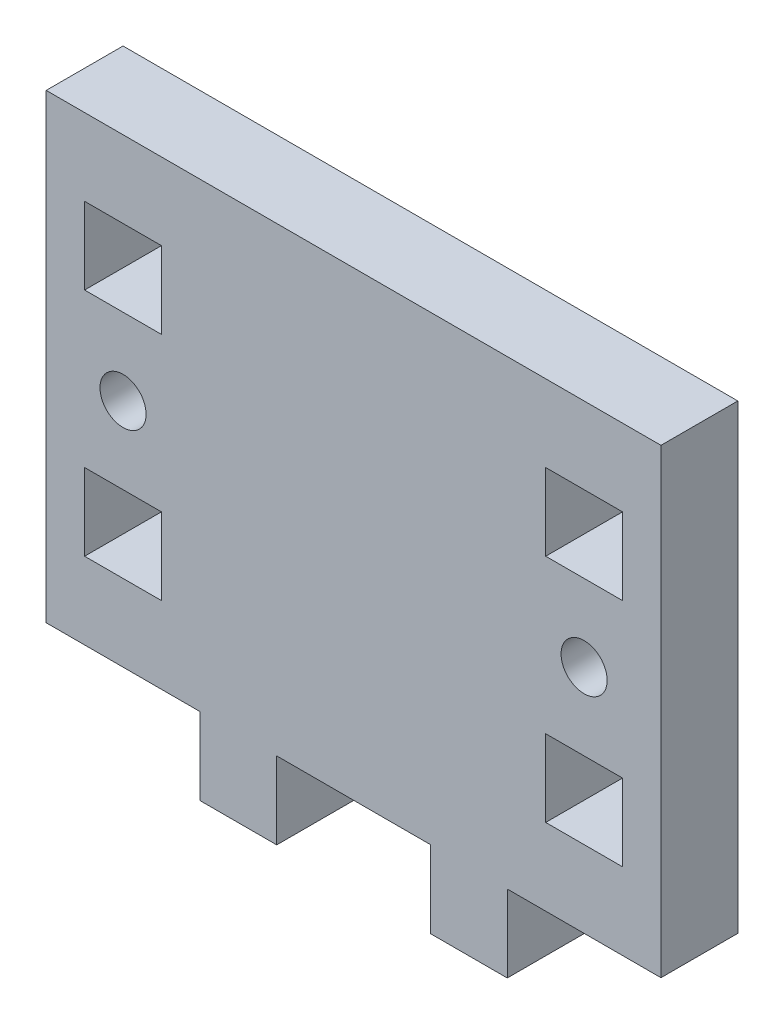
ISO-10303-21;
HEADER;
FILE_DESCRIPTION(('STEP AP214'),'2;1');
FILE_NAME('part.step','',(''),(''),'','','');
FILE_SCHEMA(('AUTOMOTIVE_DESIGN { 1 0 10303 214 1 1 1 1 }'));
ENDSEC;
DATA;
#1=APPLICATION_CONTEXT('core data for automotive mechanical design processes');
#2=APPLICATION_PROTOCOL_DEFINITION('international standard','automotive_design',2000,#1);
#3=PRODUCT_CONTEXT('',#1,'mechanical');
#4=PRODUCT('Part','Part','',(#3));
#5=PRODUCT_RELATED_PRODUCT_CATEGORY('part','',(#4));
#6=PRODUCT_DEFINITION_FORMATION('','',#4);
#7=PRODUCT_DEFINITION_CONTEXT('part definition',#1,'design');
#8=PRODUCT_DEFINITION('design','',#6,#7);
#9=PRODUCT_DEFINITION_SHAPE('','',#8);
#10=(LENGTH_UNIT() NAMED_UNIT(*) SI_UNIT(.MILLI.,.METRE.));
#11=(NAMED_UNIT(*) PLANE_ANGLE_UNIT() SI_UNIT($,.RADIAN.));
#12=(NAMED_UNIT(*) SI_UNIT($,.STERADIAN.) SOLID_ANGLE_UNIT());
#13=UNCERTAINTY_MEASURE_WITH_UNIT(LENGTH_MEASURE(1.E-05),#10,'distance_accuracy_value','');
#14=(GEOMETRIC_REPRESENTATION_CONTEXT(3) GLOBAL_UNCERTAINTY_ASSIGNED_CONTEXT((#13)) GLOBAL_UNIT_ASSIGNED_CONTEXT((#10,
#11,#12)) REPRESENTATION_CONTEXT('',''));
#15=CARTESIAN_POINT('',(0.,0.,0.));
#16=DIRECTION('',(0.,0.,1.));
#17=DIRECTION('',(1.,0.,0.));
#18=AXIS2_PLACEMENT_3D('',#15,#16,#17);
#19=CARTESIAN_POINT('',(0.,0.,5.));
#20=DIRECTION('',(0.,0.,-1.));
#21=DIRECTION('',(-1.,0.,0.));
#22=AXIS2_PLACEMENT_3D('',#19,#20,#21);
#23=PLANE('',#22);
#24=DIRECTION('',(-1.,0.,0.));
#25=VECTOR('',#24,1.);
#26=CARTESIAN_POINT('',(7.5,15.0153904422342,5.));
#27=LINE('',#26,#25);
#28=CARTESIAN_POINT('',(12.5,15.0153904422342,5.));
#29=VERTEX_POINT('',#28);
#30=CARTESIAN_POINT('',(7.5,15.0153904422342,5.));
#31=VERTEX_POINT('',#30);
#32=EDGE_CURVE('E260',#29,#31,#27,.T.);
#33=ORIENTED_EDGE('',*,*,#32,.F.);
#34=DIRECTION('',(0.,1.,0.));
#35=VECTOR('',#34,1.);
#36=CARTESIAN_POINT('',(12.5,15.0153904422342,5.));
#37=LINE('',#36,#35);
#38=CARTESIAN_POINT('',(12.5,10.0153904422342,5.));
#39=VERTEX_POINT('',#38);
#40=EDGE_CURVE('E268',#39,#29,#37,.T.);
#41=ORIENTED_EDGE('',*,*,#40,.F.);
#42=DIRECTION('',(1.,0.,0.));
#43=VECTOR('',#42,1.);
#44=CARTESIAN_POINT('',(7.49999999999999,10.0153904422342,5.));
#45=LINE('',#44,#43);
#46=CARTESIAN_POINT('',(7.49999999999999,10.0153904422342,5.));
#47=VERTEX_POINT('',#46);
#48=EDGE_CURVE('E265',#47,#39,#45,.T.);
#49=ORIENTED_EDGE('',*,*,#48,.F.);
#50=DIRECTION('',(0.,-1.,0.));
#51=VECTOR('',#50,1.);
#52=CARTESIAN_POINT('',(7.5,15.0153904422342,5.));
#53=LINE('',#52,#51);
#54=EDGE_CURVE('E262',#31,#47,#53,.T.);
#55=ORIENTED_EDGE('',*,*,#54,.F.);
#56=EDGE_LOOP('',(#33,#41,#49,#55));
#57=FACE_BOUND('',#56,.T.);
#58=DIRECTION('',(-1.,0.,0.));
#59=VECTOR('',#58,1.);
#60=CARTESIAN_POINT('',(-22.5,15.0153904422342,5.));
#61=LINE('',#60,#59);
#62=CARTESIAN_POINT('',(-17.5,15.0153904422342,5.));
#63=VERTEX_POINT('',#62);
#64=CARTESIAN_POINT('',(-22.5,15.0153904422342,5.));
#65=VERTEX_POINT('',#64);
#66=EDGE_CURVE('E328',#63,#65,#61,.T.);
#67=ORIENTED_EDGE('',*,*,#66,.F.);
#68=DIRECTION('',(0.,1.,0.));
#69=VECTOR('',#68,1.);
#70=CARTESIAN_POINT('',(-17.5,15.0153904422342,5.));
#71=LINE('',#70,#69);
#72=CARTESIAN_POINT('',(-17.5,10.0153904422342,5.));
#73=VERTEX_POINT('',#72);
#74=EDGE_CURVE('E336',#73,#63,#71,.T.);
#75=ORIENTED_EDGE('',*,*,#74,.F.);
#76=DIRECTION('',(1.,0.,0.));
#77=VECTOR('',#76,1.);
#78=CARTESIAN_POINT('',(-22.5,10.0153904422342,5.));
#79=LINE('',#78,#77);
#80=CARTESIAN_POINT('',(-22.5,10.0153904422342,5.));
#81=VERTEX_POINT('',#80);
#82=EDGE_CURVE('E333',#81,#73,#79,.T.);
#83=ORIENTED_EDGE('',*,*,#82,.F.);
#84=DIRECTION('',(0.,-1.,0.));
#85=VECTOR('',#84,1.);
#86=CARTESIAN_POINT('',(-22.5,15.0153904422342,5.));
#87=LINE('',#86,#85);
#88=EDGE_CURVE('E330',#65,#81,#87,.T.);
#89=ORIENTED_EDGE('',*,*,#88,.F.);
#90=EDGE_LOOP('',(#67,#75,#83,#89));
#91=FACE_BOUND('',#90,.T.);
#92=DIRECTION('',(1.,0.,0.));
#93=VECTOR('',#92,1.);
#94=CARTESIAN_POINT('',(5.,0.,5.));
#95=LINE('',#94,#93);
#96=CARTESIAN_POINT('',(0.,0.,5.));
#97=VERTEX_POINT('',#96);
#98=CARTESIAN_POINT('',(5.,0.,5.));
#99=VERTEX_POINT('',#98);
#100=EDGE_CURVE('E359',#97,#99,#95,.T.);
#101=ORIENTED_EDGE('',*,*,#100,.T.);
#102=DIRECTION('',(0.,1.,0.));
#103=VECTOR('',#102,1.);
#104=CARTESIAN_POINT('',(5.,5.01539044223422,5.));
#105=LINE('',#104,#103);
#106=CARTESIAN_POINT('',(5.,5.01539044223422,5.));
#107=VERTEX_POINT('',#106);
#108=EDGE_CURVE('E362',#99,#107,#105,.T.);
#109=ORIENTED_EDGE('',*,*,#108,.T.);
#110=DIRECTION('',(1.,0.,0.));
#111=VECTOR('',#110,1.);
#112=CARTESIAN_POINT('',(15.,5.01539044223422,5.));
#113=LINE('',#112,#111);
#114=CARTESIAN_POINT('',(15.,5.01539044223422,5.));
#115=VERTEX_POINT('',#114);
#116=EDGE_CURVE('E365',#107,#115,#113,.T.);
#117=ORIENTED_EDGE('',*,*,#116,.T.);
#118=DIRECTION('',(0.,1.,0.));
#119=VECTOR('',#118,1.);
#120=CARTESIAN_POINT('',(15.,35.0153904422342,5.));
#121=LINE('',#120,#119);
#122=CARTESIAN_POINT('',(15.,35.0153904422342,5.));
#123=VERTEX_POINT('',#122);
#124=EDGE_CURVE('E367',#115,#123,#121,.T.);
#125=ORIENTED_EDGE('',*,*,#124,.T.);
#126=DIRECTION('',(-1.,0.,0.));
#127=VECTOR('',#126,1.);
#128=CARTESIAN_POINT('',(-25.,35.0153904422342,5.));
#129=LINE('',#128,#127);
#130=CARTESIAN_POINT('',(-25.,35.0153904422342,5.));
#131=VERTEX_POINT('',#130);
#132=EDGE_CURVE('E369',#123,#131,#129,.T.);
#133=ORIENTED_EDGE('',*,*,#132,.T.);
#134=DIRECTION('',(0.,-1.,0.));
#135=VECTOR('',#134,1.);
#136=CARTESIAN_POINT('',(-25.,5.01539044223421,5.));
#137=LINE('',#136,#135);
#138=CARTESIAN_POINT('',(-25.,5.01539044223421,5.));
#139=VERTEX_POINT('',#138);
#140=EDGE_CURVE('E371',#131,#139,#137,.T.);
#141=ORIENTED_EDGE('',*,*,#140,.T.);
#142=DIRECTION('',(1.,0.,0.));
#143=VECTOR('',#142,1.);
#144=CARTESIAN_POINT('',(-15.,5.01539044223421,5.));
#145=LINE('',#144,#143);
#146=CARTESIAN_POINT('',(-15.,5.01539044223421,5.));
#147=VERTEX_POINT('',#146);
#148=EDGE_CURVE('E373',#139,#147,#145,.T.);
#149=ORIENTED_EDGE('',*,*,#148,.T.);
#150=DIRECTION('',(0.,-1.,0.));
#151=VECTOR('',#150,1.);
#152=CARTESIAN_POINT('',(-15.,0.,5.));
#153=LINE('',#152,#151);
#154=CARTESIAN_POINT('',(-15.,0.,5.));
#155=VERTEX_POINT('',#154);
#156=EDGE_CURVE('E375',#147,#155,#153,.T.);
#157=ORIENTED_EDGE('',*,*,#156,.T.);
#158=DIRECTION('',(1.,0.,0.));
#159=VECTOR('',#158,1.);
#160=CARTESIAN_POINT('',(-10.,0.,5.));
#161=LINE('',#160,#159);
#162=CARTESIAN_POINT('',(-10.,0.,5.));
#163=VERTEX_POINT('',#162);
#164=EDGE_CURVE('E377',#155,#163,#161,.T.);
#165=ORIENTED_EDGE('',*,*,#164,.T.);
#166=DIRECTION('',(0.,1.,0.));
#167=VECTOR('',#166,1.);
#168=CARTESIAN_POINT('',(-10.,5.01539044223422,5.));
#169=LINE('',#168,#167);
#170=CARTESIAN_POINT('',(-10.,5.01539044223422,5.));
#171=VERTEX_POINT('',#170);
#172=EDGE_CURVE('E379',#163,#171,#169,.T.);
#173=ORIENTED_EDGE('',*,*,#172,.T.);
#174=DIRECTION('',(1.,0.,0.));
#175=VECTOR('',#174,1.);
#176=CARTESIAN_POINT('',(0.,5.01539044223422,5.));
#177=LINE('',#176,#175);
#178=CARTESIAN_POINT('',(0.,5.01539044223422,5.));
#179=VERTEX_POINT('',#178);
#180=EDGE_CURVE('E381',#171,#179,#177,.T.);
#181=ORIENTED_EDGE('',*,*,#180,.T.);
#182=DIRECTION('',(0.,-1.,0.));
#183=VECTOR('',#182,1.);
#184=CARTESIAN_POINT('',(0.,0.,5.));
#185=LINE('',#184,#183);
#186=EDGE_CURVE('E383',#179,#97,#185,.T.);
#187=ORIENTED_EDGE('',*,*,#186,.T.);
#188=EDGE_LOOP('',(#101,#109,#117,#125,#133,#141,#149,#157,#165,#173,#181,#187));
#189=FACE_BOUND('',#188,.T.);
#190=DIRECTION('',(1.,0.,0.));
#191=VECTOR('',#190,1.);
#192=CARTESIAN_POINT('',(-22.5,25.0153904422342,5.));
#193=LINE('',#192,#191);
#194=CARTESIAN_POINT('',(-22.5,25.0153904422342,5.));
#195=VERTEX_POINT('',#194);
#196=CARTESIAN_POINT('',(-17.5,25.0153904422342,5.));
#197=VERTEX_POINT('',#196);
#198=EDGE_CURVE('E297',#195,#197,#193,.T.);
#199=ORIENTED_EDGE('',*,*,#198,.F.);
#200=DIRECTION('',(0.,-1.,0.));
#201=VECTOR('',#200,1.);
#202=CARTESIAN_POINT('',(-22.5,25.0153904422342,5.));
#203=LINE('',#202,#201);
#204=CARTESIAN_POINT('',(-22.5,30.0153904422342,5.));
#205=VERTEX_POINT('',#204);
#206=EDGE_CURVE('E305',#205,#195,#203,.T.);
#207=ORIENTED_EDGE('',*,*,#206,.F.);
#208=DIRECTION('',(-1.,0.,0.));
#209=VECTOR('',#208,1.);
#210=CARTESIAN_POINT('',(-22.5,30.0153904422342,5.));
#211=LINE('',#210,#209);
#212=CARTESIAN_POINT('',(-17.5,30.0153904422342,5.));
#213=VERTEX_POINT('',#212);
#214=EDGE_CURVE('E302',#213,#205,#211,.T.);
#215=ORIENTED_EDGE('',*,*,#214,.F.);
#216=DIRECTION('',(0.,1.,0.));
#217=VECTOR('',#216,1.);
#218=CARTESIAN_POINT('',(-17.5,25.0153904422342,5.));
#219=LINE('',#218,#217);
#220=EDGE_CURVE('E299',#197,#213,#219,.T.);
#221=ORIENTED_EDGE('',*,*,#220,.F.);
#222=EDGE_LOOP('',(#199,#207,#215,#221));
#223=FACE_BOUND('',#222,.T.);
#224=CARTESIAN_POINT('',(-20.,20.0153904422342,5.));
#225=DIRECTION('',(0.,0.,1.));
#226=DIRECTION('',(1.,0.,0.));
#227=AXIS2_PLACEMENT_3D('',#224,#225,#226);
#228=CIRCLE('',#227,1.5);
#229=CARTESIAN_POINT('',(-18.5,20.0153904422342,5.));
#230=VERTEX_POINT('',#229);
#231=EDGE_CURVE('E291',#230,#230,#228,.T.);
#232=ORIENTED_EDGE('',*,*,#231,.F.);
#233=EDGE_LOOP('',(#232));
#234=FACE_BOUND('',#233,.T.);
#235=DIRECTION('',(1.,0.,0.));
#236=VECTOR('',#235,1.);
#237=CARTESIAN_POINT('',(7.5,25.0153904422342,5.));
#238=LINE('',#237,#236);
#239=CARTESIAN_POINT('',(7.5,25.0153904422342,5.));
#240=VERTEX_POINT('',#239);
#241=CARTESIAN_POINT('',(12.5,25.0153904422342,5.));
#242=VERTEX_POINT('',#241);
#243=EDGE_CURVE('E221',#240,#242,#238,.T.);
#244=ORIENTED_EDGE('',*,*,#243,.F.);
#245=DIRECTION('',(0.,-1.,0.));
#246=VECTOR('',#245,1.);
#247=CARTESIAN_POINT('',(7.5,25.0153904422342,5.));
#248=LINE('',#247,#246);
#249=CARTESIAN_POINT('',(7.5,30.0153904422342,5.));
#250=VERTEX_POINT('',#249);
#251=EDGE_CURVE('E244',#250,#240,#248,.T.);
#252=ORIENTED_EDGE('',*,*,#251,.F.);
#253=DIRECTION('',(-1.,0.,0.));
#254=VECTOR('',#253,1.);
#255=CARTESIAN_POINT('',(7.5,30.0153904422342,5.));
#256=LINE('',#255,#254);
#257=CARTESIAN_POINT('',(12.5,30.0153904422342,5.));
#258=VERTEX_POINT('',#257);
#259=EDGE_CURVE('E242',#258,#250,#256,.T.);
#260=ORIENTED_EDGE('',*,*,#259,.F.);
#261=DIRECTION('',(0.,1.,0.));
#262=VECTOR('',#261,1.);
#263=CARTESIAN_POINT('',(12.5,25.0153904422342,5.));
#264=LINE('',#263,#262);
#265=EDGE_CURVE('E229',#242,#258,#264,.T.);
#266=ORIENTED_EDGE('',*,*,#265,.F.);
#267=EDGE_LOOP('',(#244,#252,#260,#266));
#268=FACE_BOUND('',#267,.T.);
#269=CARTESIAN_POINT('',(9.99999999999999,20.0153904422342,5.));
#270=DIRECTION('',(0.,0.,1.));
#271=DIRECTION('',(1.,0.,0.));
#272=AXIS2_PLACEMENT_3D('',#269,#270,#271);
#273=CIRCLE('',#272,1.5);
#274=CARTESIAN_POINT('',(11.5,20.0153904422342,5.));
#275=VERTEX_POINT('',#274);
#276=EDGE_CURVE('E250',#275,#275,#273,.T.);
#277=ORIENTED_EDGE('',*,*,#276,.F.);
#278=EDGE_LOOP('',(#277));
#279=FACE_BOUND('',#278,.T.);
#280=ADVANCED_FACE('F36',(#57,#91,#189,#223,#234,#268,#279),#23,.F.);
#281=CARTESIAN_POINT('',(0.,0.,0.));
#282=DIRECTION('',(0.,0.,-1.));
#283=DIRECTION('',(-1.,0.,0.));
#284=AXIS2_PLACEMENT_3D('',#281,#282,#283);
#285=PLANE('',#284);
#286=DIRECTION('',(0.,-1.,0.));
#287=VECTOR('',#286,1.);
#288=CARTESIAN_POINT('',(7.5,25.0153904422342,0.));
#289=LINE('',#288,#287);
#290=CARTESIAN_POINT('',(7.5,30.0153904422342,0.));
#291=VERTEX_POINT('',#290);
#292=CARTESIAN_POINT('',(7.5,25.0153904422342,0.));
#293=VERTEX_POINT('',#292);
#294=EDGE_CURVE('E230',#291,#293,#289,.T.);
#295=ORIENTED_EDGE('',*,*,#294,.T.);
#296=DIRECTION('',(1.,0.,0.));
#297=VECTOR('',#296,1.);
#298=CARTESIAN_POINT('',(7.5,25.0153904422342,0.));
#299=LINE('',#298,#297);
#300=CARTESIAN_POINT('',(12.5,25.0153904422342,0.));
#301=VERTEX_POINT('',#300);
#302=EDGE_CURVE('E59',#293,#301,#299,.T.);
#303=ORIENTED_EDGE('',*,*,#302,.T.);
#304=DIRECTION('',(0.,1.,0.));
#305=VECTOR('',#304,1.);
#306=CARTESIAN_POINT('',(12.5,25.0153904422342,0.));
#307=LINE('',#306,#305);
#308=CARTESIAN_POINT('',(12.5,30.0153904422342,0.));
#309=VERTEX_POINT('',#308);
#310=EDGE_CURVE('E236',#301,#309,#307,.T.);
#311=ORIENTED_EDGE('',*,*,#310,.T.);
#312=DIRECTION('',(-1.,0.,0.));
#313=VECTOR('',#312,1.);
#314=CARTESIAN_POINT('',(7.5,30.0153904422342,0.));
#315=LINE('',#314,#313);
#316=EDGE_CURVE('E252',#309,#291,#315,.T.);
#317=ORIENTED_EDGE('',*,*,#316,.T.);
#318=EDGE_LOOP('',(#295,#303,#311,#317));
#319=FACE_BOUND('',#318,.T.);
#320=DIRECTION('',(0.,1.,0.));
#321=VECTOR('',#320,1.);
#322=CARTESIAN_POINT('',(12.5,15.0153904422342,0.));
#323=LINE('',#322,#321);
#324=CARTESIAN_POINT('',(12.5,10.0153904422342,0.));
#325=VERTEX_POINT('',#324);
#326=CARTESIAN_POINT('',(12.5,15.0153904422342,0.));
#327=VERTEX_POINT('',#326);
#328=EDGE_CURVE('E263',#325,#327,#323,.T.);
#329=ORIENTED_EDGE('',*,*,#328,.T.);
#330=DIRECTION('',(-1.,0.,0.));
#331=VECTOR('',#330,1.);
#332=CARTESIAN_POINT('',(7.5,15.0153904422342,0.));
#333=LINE('',#332,#331);
#334=CARTESIAN_POINT('',(7.5,15.0153904422342,0.));
#335=VERTEX_POINT('',#334);
#336=EDGE_CURVE('E237',#327,#335,#333,.T.);
#337=ORIENTED_EDGE('',*,*,#336,.T.);
#338=DIRECTION('',(0.,-1.,0.));
#339=VECTOR('',#338,1.);
#340=CARTESIAN_POINT('',(7.5,15.0153904422342,0.));
#341=LINE('',#340,#339);
#342=CARTESIAN_POINT('',(7.49999999999999,10.0153904422342,0.));
#343=VERTEX_POINT('',#342);
#344=EDGE_CURVE('E273',#335,#343,#341,.T.);
#345=ORIENTED_EDGE('',*,*,#344,.T.);
#346=DIRECTION('',(1.,0.,0.));
#347=VECTOR('',#346,1.);
#348=CARTESIAN_POINT('',(7.49999999999999,10.0153904422342,0.));
#349=LINE('',#348,#347);
#350=EDGE_CURVE('E276',#343,#325,#349,.T.);
#351=ORIENTED_EDGE('',*,*,#350,.T.);
#352=EDGE_LOOP('',(#329,#337,#345,#351));
#353=FACE_BOUND('',#352,.T.);
#354=CARTESIAN_POINT('',(-20.,20.0153904422342,0.));
#355=DIRECTION('',(0.,0.,1.));
#356=DIRECTION('',(1.,0.,0.));
#357=AXIS2_PLACEMENT_3D('',#354,#355,#356);
#358=CIRCLE('',#357,1.5);
#359=CARTESIAN_POINT('',(-18.5,20.0153904422342,0.));
#360=VERTEX_POINT('',#359);
#361=EDGE_CURVE('E290',#360,#360,#358,.T.);
#362=ORIENTED_EDGE('',*,*,#361,.T.);
#363=EDGE_LOOP('',(#362));
#364=FACE_BOUND('',#363,.T.);
#365=DIRECTION('',(1.,0.,0.));
#366=VECTOR('',#365,1.);
#367=CARTESIAN_POINT('',(5.,0.,0.));
#368=LINE('',#367,#366);
#369=CARTESIAN_POINT('',(0.,0.,0.));
#370=VERTEX_POINT('',#369);
#371=CARTESIAN_POINT('',(5.,0.,0.));
#372=VERTEX_POINT('',#371);
#373=EDGE_CURVE('E358',#370,#372,#368,.T.);
#374=ORIENTED_EDGE('',*,*,#373,.F.);
#375=DIRECTION('',(0.,-1.,0.));
#376=VECTOR('',#375,1.);
#377=CARTESIAN_POINT('',(0.,0.,0.));
#378=LINE('',#377,#376);
#379=CARTESIAN_POINT('',(0.,5.01539044223422,0.));
#380=VERTEX_POINT('',#379);
#381=EDGE_CURVE('E363',#380,#370,#378,.T.);
#382=ORIENTED_EDGE('',*,*,#381,.F.);
#383=DIRECTION('',(1.,0.,0.));
#384=VECTOR('',#383,1.);
#385=CARTESIAN_POINT('',(0.,5.01539044223422,0.));
#386=LINE('',#385,#384);
#387=CARTESIAN_POINT('',(-10.,5.01539044223422,0.));
#388=VERTEX_POINT('',#387);
#389=EDGE_CURVE('E406',#388,#380,#386,.T.);
#390=ORIENTED_EDGE('',*,*,#389,.F.);
#391=DIRECTION('',(0.,1.,0.));
#392=VECTOR('',#391,1.);
#393=CARTESIAN_POINT('',(-10.,5.01539044223422,0.));
#394=LINE('',#393,#392);
#395=CARTESIAN_POINT('',(-10.,0.,0.));
#396=VERTEX_POINT('',#395);
#397=EDGE_CURVE('E404',#396,#388,#394,.T.);
#398=ORIENTED_EDGE('',*,*,#397,.F.);
#399=DIRECTION('',(1.,0.,0.));
#400=VECTOR('',#399,1.);
#401=CARTESIAN_POINT('',(-10.,0.,0.));
#402=LINE('',#401,#400);
#403=CARTESIAN_POINT('',(-15.,0.,0.));
#404=VERTEX_POINT('',#403);
#405=EDGE_CURVE('E402',#404,#396,#402,.T.);
#406=ORIENTED_EDGE('',*,*,#405,.F.);
#407=DIRECTION('',(0.,-1.,0.));
#408=VECTOR('',#407,1.);
#409=CARTESIAN_POINT('',(-15.,0.,0.));
#410=LINE('',#409,#408);
#411=CARTESIAN_POINT('',(-15.,5.01539044223421,0.));
#412=VERTEX_POINT('',#411);
#413=EDGE_CURVE('E400',#412,#404,#410,.T.);
#414=ORIENTED_EDGE('',*,*,#413,.F.);
#415=DIRECTION('',(1.,0.,0.));
#416=VECTOR('',#415,1.);
#417=CARTESIAN_POINT('',(-15.,5.01539044223421,0.));
#418=LINE('',#417,#416);
#419=CARTESIAN_POINT('',(-25.,5.01539044223421,0.));
#420=VERTEX_POINT('',#419);
#421=EDGE_CURVE('E398',#420,#412,#418,.T.);
#422=ORIENTED_EDGE('',*,*,#421,.F.);
#423=DIRECTION('',(0.,-1.,0.));
#424=VECTOR('',#423,1.);
#425=CARTESIAN_POINT('',(-25.,5.01539044223421,0.));
#426=LINE('',#425,#424);
#427=CARTESIAN_POINT('',(-25.,35.0153904422342,0.));
#428=VERTEX_POINT('',#427);
#429=EDGE_CURVE('E396',#428,#420,#426,.T.);
#430=ORIENTED_EDGE('',*,*,#429,.F.);
#431=DIRECTION('',(-1.,0.,0.));
#432=VECTOR('',#431,1.);
#433=CARTESIAN_POINT('',(-25.,35.0153904422342,0.));
#434=LINE('',#433,#432);
#435=CARTESIAN_POINT('',(15.,35.0153904422342,0.));
#436=VERTEX_POINT('',#435);
#437=EDGE_CURVE('E394',#436,#428,#434,.T.);
#438=ORIENTED_EDGE('',*,*,#437,.F.);
#439=DIRECTION('',(0.,1.,0.));
#440=VECTOR('',#439,1.);
#441=CARTESIAN_POINT('',(15.,35.0153904422342,0.));
#442=LINE('',#441,#440);
#443=CARTESIAN_POINT('',(15.,5.01539044223422,0.));
#444=VERTEX_POINT('',#443);
#445=EDGE_CURVE('E392',#444,#436,#442,.T.);
#446=ORIENTED_EDGE('',*,*,#445,.F.);
#447=DIRECTION('',(1.,0.,0.));
#448=VECTOR('',#447,1.);
#449=CARTESIAN_POINT('',(15.,5.01539044223422,0.));
#450=LINE('',#449,#448);
#451=CARTESIAN_POINT('',(5.,5.01539044223422,0.));
#452=VERTEX_POINT('',#451);
#453=EDGE_CURVE('E390',#452,#444,#450,.T.);
#454=ORIENTED_EDGE('',*,*,#453,.F.);
#455=DIRECTION('',(0.,1.,0.));
#456=VECTOR('',#455,1.);
#457=CARTESIAN_POINT('',(5.,5.01539044223422,0.));
#458=LINE('',#457,#456);
#459=EDGE_CURVE('E388',#372,#452,#458,.T.);
#460=ORIENTED_EDGE('',*,*,#459,.F.);
#461=EDGE_LOOP('',(#374,#382,#390,#398,#406,#414,#422,#430,#438,#446,#454,#460));
#462=FACE_BOUND('',#461,.T.);
#463=DIRECTION('',(0.,1.,0.));
#464=VECTOR('',#463,1.);
#465=CARTESIAN_POINT('',(-17.5,15.0153904422342,0.));
#466=LINE('',#465,#464);
#467=CARTESIAN_POINT('',(-17.5,10.0153904422342,0.));
#468=VERTEX_POINT('',#467);
#469=CARTESIAN_POINT('',(-17.5,15.0153904422342,0.));
#470=VERTEX_POINT('',#469);
#471=EDGE_CURVE('E331',#468,#470,#466,.T.);
#472=ORIENTED_EDGE('',*,*,#471,.T.);
#473=DIRECTION('',(-1.,0.,0.));
#474=VECTOR('',#473,1.);
#475=CARTESIAN_POINT('',(-22.5,15.0153904422342,0.));
#476=LINE('',#475,#474);
#477=CARTESIAN_POINT('',(-22.5,15.0153904422342,0.));
#478=VERTEX_POINT('',#477);
#479=EDGE_CURVE('E327',#470,#478,#476,.T.);
#480=ORIENTED_EDGE('',*,*,#479,.T.);
#481=DIRECTION('',(0.,-1.,0.));
#482=VECTOR('',#481,1.);
#483=CARTESIAN_POINT('',(-22.5,15.0153904422342,0.));
#484=LINE('',#483,#482);
#485=CARTESIAN_POINT('',(-22.5,10.0153904422342,0.));
#486=VERTEX_POINT('',#485);
#487=EDGE_CURVE('E341',#478,#486,#484,.T.);
#488=ORIENTED_EDGE('',*,*,#487,.T.);
#489=DIRECTION('',(1.,0.,0.));
#490=VECTOR('',#489,1.);
#491=CARTESIAN_POINT('',(-22.5,10.0153904422342,0.));
#492=LINE('',#491,#490);
#493=EDGE_CURVE('E344',#486,#468,#492,.T.);
#494=ORIENTED_EDGE('',*,*,#493,.T.);
#495=EDGE_LOOP('',(#472,#480,#488,#494));
#496=FACE_BOUND('',#495,.T.);
#497=DIRECTION('',(0.,-1.,0.));
#498=VECTOR('',#497,1.);
#499=CARTESIAN_POINT('',(-22.5,25.0153904422342,0.));
#500=LINE('',#499,#498);
#501=CARTESIAN_POINT('',(-22.5,30.0153904422342,0.));
#502=VERTEX_POINT('',#501);
#503=CARTESIAN_POINT('',(-22.5,25.0153904422342,0.));
#504=VERTEX_POINT('',#503);
#505=EDGE_CURVE('E300',#502,#504,#500,.T.);
#506=ORIENTED_EDGE('',*,*,#505,.T.);
#507=DIRECTION('',(1.,0.,0.));
#508=VECTOR('',#507,1.);
#509=CARTESIAN_POINT('',(-22.5,25.0153904422342,0.));
#510=LINE('',#509,#508);
#511=CARTESIAN_POINT('',(-17.5,25.0153904422342,0.));
#512=VERTEX_POINT('',#511);
#513=EDGE_CURVE('E294',#504,#512,#510,.T.);
#514=ORIENTED_EDGE('',*,*,#513,.T.);
#515=DIRECTION('',(0.,1.,0.));
#516=VECTOR('',#515,1.);
#517=CARTESIAN_POINT('',(-17.5,25.0153904422342,0.));
#518=LINE('',#517,#516);
#519=CARTESIAN_POINT('',(-17.5,30.0153904422342,0.));
#520=VERTEX_POINT('',#519);
#521=EDGE_CURVE('E310',#512,#520,#518,.T.);
#522=ORIENTED_EDGE('',*,*,#521,.T.);
#523=DIRECTION('',(-1.,0.,0.));
#524=VECTOR('',#523,1.);
#525=CARTESIAN_POINT('',(-22.5,30.0153904422342,0.));
#526=LINE('',#525,#524);
#527=EDGE_CURVE('E313',#520,#502,#526,.T.);
#528=ORIENTED_EDGE('',*,*,#527,.T.);
#529=EDGE_LOOP('',(#506,#514,#522,#528));
#530=FACE_BOUND('',#529,.T.);
#531=CARTESIAN_POINT('',(9.99999999999999,20.0153904422342,0.));
#532=DIRECTION('',(0.,0.,1.));
#533=DIRECTION('',(1.,0.,0.));
#534=AXIS2_PLACEMENT_3D('',#531,#532,#533);
#535=CIRCLE('',#534,1.5);
#536=CARTESIAN_POINT('',(11.5,20.0153904422342,0.));
#537=VERTEX_POINT('',#536);
#538=EDGE_CURVE('E794',#537,#537,#535,.T.);
#539=ORIENTED_EDGE('',*,*,#538,.T.);
#540=EDGE_LOOP('',(#539));
#541=FACE_BOUND('',#540,.T.);
#542=ADVANCED_FACE('F448',(#319,#353,#364,#462,#496,#530,#541),#285,.T.);
#543=CARTESIAN_POINT('',(5.,0.,5.));
#544=DIRECTION('',(0.,1.,0.));
#545=DIRECTION('',(-1.,0.,0.));
#546=AXIS2_PLACEMENT_3D('',#543,#544,#545);
#547=PLANE('',#546);
#548=ORIENTED_EDGE('',*,*,#373,.T.);
#549=DIRECTION('',(0.,0.,-1.));
#550=VECTOR('',#549,1.);
#551=CARTESIAN_POINT('',(5.,0.,5.));
#552=LINE('',#551,#550);
#553=EDGE_CURVE('E11',#99,#372,#552,.T.);
#554=ORIENTED_EDGE('',*,*,#553,.F.);
#555=ORIENTED_EDGE('',*,*,#100,.F.);
#556=DIRECTION('',(0.,0.,-1.));
#557=VECTOR('',#556,1.);
#558=CARTESIAN_POINT('',(0.,0.,5.));
#559=LINE('',#558,#557);
#560=EDGE_CURVE('E385',#97,#370,#559,.T.);
#561=ORIENTED_EDGE('',*,*,#560,.T.);
#562=EDGE_LOOP('',(#548,#554,#555,#561));
#563=FACE_BOUND('',#562,.T.);
#564=ADVANCED_FACE('F38',(#563),#547,.F.);
#565=CARTESIAN_POINT('',(5.,5.01539044223422,5.));
#566=DIRECTION('',(-1.,0.,0.));
#567=DIRECTION('',(0.,-1.,0.));
#568=AXIS2_PLACEMENT_3D('',#565,#566,#567);
#569=PLANE('',#568);
#570=ORIENTED_EDGE('',*,*,#459,.T.);
#571=DIRECTION('',(0.,0.,-1.));
#572=VECTOR('',#571,1.);
#573=CARTESIAN_POINT('',(5.,5.01539044223422,5.));
#574=LINE('',#573,#572);
#575=EDGE_CURVE('E44',#107,#452,#574,.T.);
#576=ORIENTED_EDGE('',*,*,#575,.F.);
#577=ORIENTED_EDGE('',*,*,#108,.F.);
#578=ORIENTED_EDGE('',*,*,#553,.T.);
#579=EDGE_LOOP('',(#570,#576,#577,#578));
#580=FACE_BOUND('',#579,.T.);
#581=ADVANCED_FACE('F466',(#580),#569,.F.);
#582=CARTESIAN_POINT('',(15.,5.01539044223422,5.));
#583=DIRECTION('',(0.,1.,0.));
#584=DIRECTION('',(-1.,0.,0.));
#585=AXIS2_PLACEMENT_3D('',#582,#583,#584);
#586=PLANE('',#585);
#587=ORIENTED_EDGE('',*,*,#453,.T.);
#588=DIRECTION('',(0.,0.,-1.));
#589=VECTOR('',#588,1.);
#590=CARTESIAN_POINT('',(15.,5.01539044223422,5.));
#591=LINE('',#590,#589);
#592=EDGE_CURVE('E435',#115,#444,#591,.T.);
#593=ORIENTED_EDGE('',*,*,#592,.F.);
#594=ORIENTED_EDGE('',*,*,#116,.F.);
#595=ORIENTED_EDGE('',*,*,#575,.T.);
#596=EDGE_LOOP('',(#587,#593,#594,#595));
#597=FACE_BOUND('',#596,.T.);
#598=ADVANCED_FACE('F442',(#597),#586,.F.);
#599=CARTESIAN_POINT('',(15.,35.0153904422342,5.));
#600=DIRECTION('',(-1.,0.,0.));
#601=DIRECTION('',(0.,0.,1.));
#602=AXIS2_PLACEMENT_3D('',#599,#600,#601);
#603=PLANE('',#602);
#604=ORIENTED_EDGE('',*,*,#445,.T.);
#605=DIRECTION('',(0.,0.,-1.));
#606=VECTOR('',#605,1.);
#607=CARTESIAN_POINT('',(15.,35.0153904422342,5.));
#608=LINE('',#607,#606);
#609=EDGE_CURVE('E432',#123,#436,#608,.T.);
#610=ORIENTED_EDGE('',*,*,#609,.F.);
#611=ORIENTED_EDGE('',*,*,#124,.F.);
#612=ORIENTED_EDGE('',*,*,#592,.T.);
#613=EDGE_LOOP('',(#604,#610,#611,#612));
#614=FACE_BOUND('',#613,.T.);
#615=ADVANCED_FACE('F454',(#614),#603,.F.);
#616=CARTESIAN_POINT('',(-25.,35.0153904422342,5.));
#617=DIRECTION('',(0.,-1.,0.));
#618=DIRECTION('',(0.,0.,-1.));
#619=AXIS2_PLACEMENT_3D('',#616,#617,#618);
#620=PLANE('',#619);
#621=ORIENTED_EDGE('',*,*,#437,.T.);
#622=DIRECTION('',(0.,0.,-1.));
#623=VECTOR('',#622,1.);
#624=CARTESIAN_POINT('',(-25.,35.0153904422342,5.));
#625=LINE('',#624,#623);
#626=EDGE_CURVE('E429',#131,#428,#625,.T.);
#627=ORIENTED_EDGE('',*,*,#626,.F.);
#628=ORIENTED_EDGE('',*,*,#132,.F.);
#629=ORIENTED_EDGE('',*,*,#609,.T.);
#630=EDGE_LOOP('',(#621,#627,#628,#629));
#631=FACE_BOUND('',#630,.T.);
#632=ADVANCED_FACE('F458',(#631),#620,.F.);
#633=CARTESIAN_POINT('',(-25.,5.01539044223421,5.));
#634=DIRECTION('',(1.,0.,0.));
#635=DIRECTION('',(0.,1.,0.));
#636=AXIS2_PLACEMENT_3D('',#633,#634,#635);
#637=PLANE('',#636);
#638=ORIENTED_EDGE('',*,*,#429,.T.);
#639=DIRECTION('',(0.,0.,-1.));
#640=VECTOR('',#639,1.);
#641=CARTESIAN_POINT('',(-25.,5.01539044223421,5.));
#642=LINE('',#641,#640);
#643=EDGE_CURVE('E426',#139,#420,#642,.T.);
#644=ORIENTED_EDGE('',*,*,#643,.F.);
#645=ORIENTED_EDGE('',*,*,#140,.F.);
#646=ORIENTED_EDGE('',*,*,#626,.T.);
#647=EDGE_LOOP('',(#638,#644,#645,#646));
#648=FACE_BOUND('',#647,.T.);
#649=ADVANCED_FACE('F499',(#648),#637,.F.);
#650=CARTESIAN_POINT('',(-15.,5.01539044223421,5.));
#651=DIRECTION('',(0.,1.,0.));
#652=DIRECTION('',(0.,0.,1.));
#653=AXIS2_PLACEMENT_3D('',#650,#651,#652);
#654=PLANE('',#653);
#655=ORIENTED_EDGE('',*,*,#421,.T.);
#656=DIRECTION('',(0.,0.,-1.));
#657=VECTOR('',#656,1.);
#658=CARTESIAN_POINT('',(-15.,5.01539044223421,5.));
#659=LINE('',#658,#657);
#660=EDGE_CURVE('E423',#147,#412,#659,.T.);
#661=ORIENTED_EDGE('',*,*,#660,.F.);
#662=ORIENTED_EDGE('',*,*,#148,.F.);
#663=ORIENTED_EDGE('',*,*,#643,.T.);
#664=EDGE_LOOP('',(#655,#661,#662,#663));
#665=FACE_BOUND('',#664,.T.);
#666=ADVANCED_FACE('F497',(#665),#654,.F.);
#667=CARTESIAN_POINT('',(-15.,0.,5.));
#668=DIRECTION('',(1.,0.,0.));
#669=DIRECTION('',(0.,0.,-1.));
#670=AXIS2_PLACEMENT_3D('',#667,#668,#669);
#671=PLANE('',#670);
#672=ORIENTED_EDGE('',*,*,#413,.T.);
#673=DIRECTION('',(0.,0.,-1.));
#674=VECTOR('',#673,1.);
#675=CARTESIAN_POINT('',(-15.,0.,5.));
#676=LINE('',#675,#674);
#677=EDGE_CURVE('E420',#155,#404,#676,.T.);
#678=ORIENTED_EDGE('',*,*,#677,.F.);
#679=ORIENTED_EDGE('',*,*,#156,.F.);
#680=ORIENTED_EDGE('',*,*,#660,.T.);
#681=EDGE_LOOP('',(#672,#678,#679,#680));
#682=FACE_BOUND('',#681,.T.);
#683=ADVANCED_FACE('F493',(#682),#671,.F.);
#684=CARTESIAN_POINT('',(-10.,0.,5.));
#685=DIRECTION('',(0.,1.,0.));
#686=DIRECTION('',(-1.,0.,0.));
#687=AXIS2_PLACEMENT_3D('',#684,#685,#686);
#688=PLANE('',#687);
#689=ORIENTED_EDGE('',*,*,#405,.T.);
#690=DIRECTION('',(0.,0.,-1.));
#691=VECTOR('',#690,1.);
#692=CARTESIAN_POINT('',(-10.,0.,5.));
#693=LINE('',#692,#691);
#694=EDGE_CURVE('E417',#163,#396,#693,.T.);
#695=ORIENTED_EDGE('',*,*,#694,.F.);
#696=ORIENTED_EDGE('',*,*,#164,.F.);
#697=ORIENTED_EDGE('',*,*,#677,.T.);
#698=EDGE_LOOP('',(#689,#695,#696,#697));
#699=FACE_BOUND('',#698,.T.);
#700=ADVANCED_FACE('F488',(#699),#688,.F.);
#701=CARTESIAN_POINT('',(-10.,5.01539044223422,5.));
#702=DIRECTION('',(-1.,0.,0.));
#703=DIRECTION('',(0.,0.,1.));
#704=AXIS2_PLACEMENT_3D('',#701,#702,#703);
#705=PLANE('',#704);
#706=ORIENTED_EDGE('',*,*,#397,.T.);
#707=DIRECTION('',(0.,0.,-1.));
#708=VECTOR('',#707,1.);
#709=CARTESIAN_POINT('',(-10.,5.01539044223422,5.));
#710=LINE('',#709,#708);
#711=EDGE_CURVE('E414',#171,#388,#710,.T.);
#712=ORIENTED_EDGE('',*,*,#711,.F.);
#713=ORIENTED_EDGE('',*,*,#172,.F.);
#714=ORIENTED_EDGE('',*,*,#694,.T.);
#715=EDGE_LOOP('',(#706,#712,#713,#714));
#716=FACE_BOUND('',#715,.T.);
#717=ADVANCED_FACE('F482',(#716),#705,.F.);
#718=CARTESIAN_POINT('',(0.,5.01539044223422,5.));
#719=DIRECTION('',(0.,1.,0.));
#720=DIRECTION('',(0.,0.,1.));
#721=AXIS2_PLACEMENT_3D('',#718,#719,#720);
#722=PLANE('',#721);
#723=ORIENTED_EDGE('',*,*,#389,.T.);
#724=DIRECTION('',(0.,0.,-1.));
#725=VECTOR('',#724,1.);
#726=CARTESIAN_POINT('',(0.,5.01539044223422,5.));
#727=LINE('',#726,#725);
#728=EDGE_CURVE('E411',#179,#380,#727,.T.);
#729=ORIENTED_EDGE('',*,*,#728,.F.);
#730=ORIENTED_EDGE('',*,*,#180,.F.);
#731=ORIENTED_EDGE('',*,*,#711,.T.);
#732=EDGE_LOOP('',(#723,#729,#730,#731));
#733=FACE_BOUND('',#732,.T.);
#734=ADVANCED_FACE('F478',(#733),#722,.F.);
#735=CARTESIAN_POINT('',(0.,0.,5.));
#736=DIRECTION('',(1.,0.,0.));
#737=DIRECTION('',(0.,1.,0.));
#738=AXIS2_PLACEMENT_3D('',#735,#736,#737);
#739=PLANE('',#738);
#740=ORIENTED_EDGE('',*,*,#381,.T.);
#741=ORIENTED_EDGE('',*,*,#560,.F.);
#742=ORIENTED_EDGE('',*,*,#186,.F.);
#743=ORIENTED_EDGE('',*,*,#728,.T.);
#744=EDGE_LOOP('',(#740,#741,#742,#743));
#745=FACE_BOUND('',#744,.T.);
#746=ADVANCED_FACE('F473',(#745),#739,.F.);
#747=CARTESIAN_POINT('',(-22.5,15.0153904422342,5.));
#748=DIRECTION('',(0.,-1.,0.));
#749=DIRECTION('',(0.,0.,-1.));
#750=AXIS2_PLACEMENT_3D('',#747,#748,#749);
#751=PLANE('',#750);
#752=ORIENTED_EDGE('',*,*,#479,.F.);
#753=DIRECTION('',(0.,0.,-1.));
#754=VECTOR('',#753,1.);
#755=CARTESIAN_POINT('',(-17.5,15.0153904422342,5.));
#756=LINE('',#755,#754);
#757=EDGE_CURVE('E338',#63,#470,#756,.T.);
#758=ORIENTED_EDGE('',*,*,#757,.F.);
#759=ORIENTED_EDGE('',*,*,#66,.T.);
#760=DIRECTION('',(0.,0.,-1.));
#761=VECTOR('',#760,1.);
#762=CARTESIAN_POINT('',(-22.5,15.0153904422342,5.));
#763=LINE('',#762,#761);
#764=EDGE_CURVE('E355',#65,#478,#763,.T.);
#765=ORIENTED_EDGE('',*,*,#764,.T.);
#766=EDGE_LOOP('',(#752,#758,#759,#765));
#767=FACE_BOUND('',#766,.T.);
#768=ADVANCED_FACE('F519',(#767),#751,.T.);
#769=CARTESIAN_POINT('',(-22.5,15.0153904422342,5.));
#770=DIRECTION('',(1.,0.,0.));
#771=DIRECTION('',(0.,0.,-1.));
#772=AXIS2_PLACEMENT_3D('',#769,#770,#771);
#773=PLANE('',#772);
#774=ORIENTED_EDGE('',*,*,#487,.F.);
#775=ORIENTED_EDGE('',*,*,#764,.F.);
#776=ORIENTED_EDGE('',*,*,#88,.T.);
#777=DIRECTION('',(0.,0.,-1.));
#778=VECTOR('',#777,1.);
#779=CARTESIAN_POINT('',(-22.5,10.0153904422342,5.));
#780=LINE('',#779,#778);
#781=EDGE_CURVE('E353',#81,#486,#780,.T.);
#782=ORIENTED_EDGE('',*,*,#781,.T.);
#783=EDGE_LOOP('',(#774,#775,#776,#782));
#784=FACE_BOUND('',#783,.T.);
#785=ADVANCED_FACE('F557',(#784),#773,.T.);
#786=CARTESIAN_POINT('',(-22.5,10.0153904422342,5.));
#787=DIRECTION('',(0.,1.,0.));
#788=DIRECTION('',(0.,0.,1.));
#789=AXIS2_PLACEMENT_3D('',#786,#787,#788);
#790=PLANE('',#789);
#791=ORIENTED_EDGE('',*,*,#493,.F.);
#792=ORIENTED_EDGE('',*,*,#781,.F.);
#793=ORIENTED_EDGE('',*,*,#82,.T.);
#794=DIRECTION('',(0.,0.,-1.));
#795=VECTOR('',#794,1.);
#796=CARTESIAN_POINT('',(-17.5,10.0153904422342,5.));
#797=LINE('',#796,#795);
#798=EDGE_CURVE('E351',#73,#468,#797,.T.);
#799=ORIENTED_EDGE('',*,*,#798,.T.);
#800=EDGE_LOOP('',(#791,#792,#793,#799));
#801=FACE_BOUND('',#800,.T.);
#802=ADVANCED_FACE('F564',(#801),#790,.T.);
#803=CARTESIAN_POINT('',(-17.5,15.0153904422342,5.));
#804=DIRECTION('',(-1.,0.,0.));
#805=DIRECTION('',(0.,0.,1.));
#806=AXIS2_PLACEMENT_3D('',#803,#804,#805);
#807=PLANE('',#806);
#808=ORIENTED_EDGE('',*,*,#471,.F.);
#809=ORIENTED_EDGE('',*,*,#798,.F.);
#810=ORIENTED_EDGE('',*,*,#74,.T.);
#811=ORIENTED_EDGE('',*,*,#757,.T.);
#812=EDGE_LOOP('',(#808,#809,#810,#811));
#813=FACE_BOUND('',#812,.T.);
#814=ADVANCED_FACE('F571',(#813),#807,.T.);
#815=CARTESIAN_POINT('',(-22.5,25.0153904422342,5.));
#816=DIRECTION('',(0.,1.,0.));
#817=DIRECTION('',(0.,0.,1.));
#818=AXIS2_PLACEMENT_3D('',#815,#816,#817);
#819=PLANE('',#818);
#820=ORIENTED_EDGE('',*,*,#513,.F.);
#821=DIRECTION('',(0.,0.,-1.));
#822=VECTOR('',#821,1.);
#823=CARTESIAN_POINT('',(-22.5,25.0153904422342,5.));
#824=LINE('',#823,#822);
#825=EDGE_CURVE('E307',#195,#504,#824,.T.);
#826=ORIENTED_EDGE('',*,*,#825,.F.);
#827=ORIENTED_EDGE('',*,*,#198,.T.);
#828=DIRECTION('',(0.,0.,-1.));
#829=VECTOR('',#828,1.);
#830=CARTESIAN_POINT('',(-17.5,25.0153904422342,5.));
#831=LINE('',#830,#829);
#832=EDGE_CURVE('E324',#197,#512,#831,.T.);
#833=ORIENTED_EDGE('',*,*,#832,.T.);
#834=EDGE_LOOP('',(#820,#826,#827,#833));
#835=FACE_BOUND('',#834,.T.);
#836=ADVANCED_FACE('F579',(#835),#819,.T.);
#837=CARTESIAN_POINT('',(-17.5,25.0153904422342,5.));
#838=DIRECTION('',(-1.,0.,0.));
#839=DIRECTION('',(0.,0.,1.));
#840=AXIS2_PLACEMENT_3D('',#837,#838,#839);
#841=PLANE('',#840);
#842=ORIENTED_EDGE('',*,*,#521,.F.);
#843=ORIENTED_EDGE('',*,*,#832,.F.);
#844=ORIENTED_EDGE('',*,*,#220,.T.);
#845=DIRECTION('',(0.,0.,-1.));
#846=VECTOR('',#845,1.);
#847=CARTESIAN_POINT('',(-17.5,30.0153904422342,5.));
#848=LINE('',#847,#846);
#849=EDGE_CURVE('E322',#213,#520,#848,.T.);
#850=ORIENTED_EDGE('',*,*,#849,.T.);
#851=EDGE_LOOP('',(#842,#843,#844,#850));
#852=FACE_BOUND('',#851,.T.);
#853=ADVANCED_FACE('F587',(#852),#841,.T.);
#854=CARTESIAN_POINT('',(-22.5,30.0153904422342,5.));
#855=DIRECTION('',(0.,-1.,0.));
#856=DIRECTION('',(0.,0.,-1.));
#857=AXIS2_PLACEMENT_3D('',#854,#855,#856);
#858=PLANE('',#857);
#859=ORIENTED_EDGE('',*,*,#527,.F.);
#860=ORIENTED_EDGE('',*,*,#849,.F.);
#861=ORIENTED_EDGE('',*,*,#214,.T.);
#862=DIRECTION('',(0.,0.,-1.));
#863=VECTOR('',#862,1.);
#864=CARTESIAN_POINT('',(-22.5,30.0153904422342,5.));
#865=LINE('',#864,#863);
#866=EDGE_CURVE('E320',#205,#502,#865,.T.);
#867=ORIENTED_EDGE('',*,*,#866,.T.);
#868=EDGE_LOOP('',(#859,#860,#861,#867));
#869=FACE_BOUND('',#868,.T.);
#870=ADVANCED_FACE('F595',(#869),#858,.T.);
#871=CARTESIAN_POINT('',(-22.5,25.0153904422342,5.));
#872=DIRECTION('',(1.,0.,0.));
#873=DIRECTION('',(0.,0.,-1.));
#874=AXIS2_PLACEMENT_3D('',#871,#872,#873);
#875=PLANE('',#874);
#876=ORIENTED_EDGE('',*,*,#505,.F.);
#877=ORIENTED_EDGE('',*,*,#866,.F.);
#878=ORIENTED_EDGE('',*,*,#206,.T.);
#879=ORIENTED_EDGE('',*,*,#825,.T.);
#880=EDGE_LOOP('',(#876,#877,#878,#879));
#881=FACE_BOUND('',#880,.T.);
#882=ADVANCED_FACE('F603',(#881),#875,.T.);
#883=CARTESIAN_POINT('',(-20.,20.0153904422342,5.));
#884=DIRECTION('',(0.,0.,-1.));
#885=DIRECTION('',(-1.,0.,0.));
#886=AXIS2_PLACEMENT_3D('',#883,#884,#885);
#887=CYLINDRICAL_SURFACE('',#886,1.5);
#888=ORIENTED_EDGE('',*,*,#231,.T.);
#889=EDGE_LOOP('',(#888));
#890=FACE_BOUND('',#889,.T.);
#891=ORIENTED_EDGE('',*,*,#361,.F.);
#892=EDGE_LOOP('',(#891));
#893=FACE_BOUND('',#892,.T.);
#894=ADVANCED_FACE('F611',(#890,#893),#887,.F.);
#895=CARTESIAN_POINT('',(7.5,15.0153904422342,5.));
#896=DIRECTION('',(0.,-1.,0.));
#897=DIRECTION('',(0.,0.,-1.));
#898=AXIS2_PLACEMENT_3D('',#895,#896,#897);
#899=PLANE('',#898);
#900=ORIENTED_EDGE('',*,*,#336,.F.);
#901=DIRECTION('',(0.,0.,-1.));
#902=VECTOR('',#901,1.);
#903=CARTESIAN_POINT('',(12.5,15.0153904422342,5.));
#904=LINE('',#903,#902);
#905=EDGE_CURVE('E270',#29,#327,#904,.T.);
#906=ORIENTED_EDGE('',*,*,#905,.F.);
#907=ORIENTED_EDGE('',*,*,#32,.T.);
#908=DIRECTION('',(0.,0.,-1.));
#909=VECTOR('',#908,1.);
#910=CARTESIAN_POINT('',(7.5,15.0153904422342,5.));
#911=LINE('',#910,#909);
#912=EDGE_CURVE('E287',#31,#335,#911,.T.);
#913=ORIENTED_EDGE('',*,*,#912,.T.);
#914=EDGE_LOOP('',(#900,#906,#907,#913));
#915=FACE_BOUND('',#914,.T.);
#916=ADVANCED_FACE('F619',(#915),#899,.T.);
#917=CARTESIAN_POINT('',(7.5,15.0153904422342,5.));
#918=DIRECTION('',(1.,0.,0.));
#919=DIRECTION('',(0.,1.,0.));
#920=AXIS2_PLACEMENT_3D('',#917,#918,#919);
#921=PLANE('',#920);
#922=ORIENTED_EDGE('',*,*,#344,.F.);
#923=ORIENTED_EDGE('',*,*,#912,.F.);
#924=ORIENTED_EDGE('',*,*,#54,.T.);
#925=DIRECTION('',(0.,0.,-1.));
#926=VECTOR('',#925,1.);
#927=CARTESIAN_POINT('',(7.49999999999999,10.0153904422342,5.));
#928=LINE('',#927,#926);
#929=EDGE_CURVE('E285',#47,#343,#928,.T.);
#930=ORIENTED_EDGE('',*,*,#929,.T.);
#931=EDGE_LOOP('',(#922,#923,#924,#930));
#932=FACE_BOUND('',#931,.T.);
#933=ADVANCED_FACE('F627',(#932),#921,.T.);
#934=CARTESIAN_POINT('',(7.49999999999999,10.0153904422342,5.));
#935=DIRECTION('',(0.,1.,0.));
#936=DIRECTION('',(0.,0.,1.));
#937=AXIS2_PLACEMENT_3D('',#934,#935,#936);
#938=PLANE('',#937);
#939=ORIENTED_EDGE('',*,*,#350,.F.);
#940=ORIENTED_EDGE('',*,*,#929,.F.);
#941=ORIENTED_EDGE('',*,*,#48,.T.);
#942=DIRECTION('',(0.,0.,-1.));
#943=VECTOR('',#942,1.);
#944=CARTESIAN_POINT('',(12.5,10.0153904422342,5.));
#945=LINE('',#944,#943);
#946=EDGE_CURVE('E283',#39,#325,#945,.T.);
#947=ORIENTED_EDGE('',*,*,#946,.T.);
#948=EDGE_LOOP('',(#939,#940,#941,#947));
#949=FACE_BOUND('',#948,.T.);
#950=ADVANCED_FACE('F635',(#949),#938,.T.);
#951=CARTESIAN_POINT('',(12.5,15.0153904422342,5.));
#952=DIRECTION('',(-1.,0.,0.));
#953=DIRECTION('',(0.,-1.,0.));
#954=AXIS2_PLACEMENT_3D('',#951,#952,#953);
#955=PLANE('',#954);
#956=ORIENTED_EDGE('',*,*,#328,.F.);
#957=ORIENTED_EDGE('',*,*,#946,.F.);
#958=ORIENTED_EDGE('',*,*,#40,.T.);
#959=ORIENTED_EDGE('',*,*,#905,.T.);
#960=EDGE_LOOP('',(#956,#957,#958,#959));
#961=FACE_BOUND('',#960,.T.);
#962=ADVANCED_FACE('F643',(#961),#955,.T.);
#963=CARTESIAN_POINT('',(7.5,25.0153904422342,5.));
#964=DIRECTION('',(0.,1.,0.));
#965=DIRECTION('',(0.,0.,1.));
#966=AXIS2_PLACEMENT_3D('',#963,#964,#965);
#967=PLANE('',#966);
#968=ORIENTED_EDGE('',*,*,#302,.F.);
#969=DIRECTION('',(0.,0.,-1.));
#970=VECTOR('',#969,1.);
#971=CARTESIAN_POINT('',(7.5,25.0153904422342,5.));
#972=LINE('',#971,#970);
#973=EDGE_CURVE('E225',#240,#293,#972,.T.);
#974=ORIENTED_EDGE('',*,*,#973,.F.);
#975=ORIENTED_EDGE('',*,*,#243,.T.);
#976=DIRECTION('',(0.,0.,-1.));
#977=VECTOR('',#976,1.);
#978=CARTESIAN_POINT('',(12.5,25.0153904422342,5.));
#979=LINE('',#978,#977);
#980=EDGE_CURVE('E224',#242,#301,#979,.T.);
#981=ORIENTED_EDGE('',*,*,#980,.T.);
#982=EDGE_LOOP('',(#968,#974,#975,#981));
#983=FACE_BOUND('',#982,.T.);
#984=ADVANCED_FACE('F223',(#983),#967,.T.);
#985=CARTESIAN_POINT('',(12.5,25.0153904422342,5.));
#986=DIRECTION('',(-1.,0.,0.));
#987=DIRECTION('',(0.,-1.,0.));
#988=AXIS2_PLACEMENT_3D('',#985,#986,#987);
#989=PLANE('',#988);
#990=ORIENTED_EDGE('',*,*,#310,.F.);
#991=ORIENTED_EDGE('',*,*,#980,.F.);
#992=ORIENTED_EDGE('',*,*,#265,.T.);
#993=DIRECTION('',(0.,0.,-1.));
#994=VECTOR('',#993,1.);
#995=CARTESIAN_POINT('',(12.5,30.0153904422342,5.));
#996=LINE('',#995,#994);
#997=EDGE_CURVE('E238',#258,#309,#996,.T.);
#998=ORIENTED_EDGE('',*,*,#997,.T.);
#999=EDGE_LOOP('',(#990,#991,#992,#998));
#1000=FACE_BOUND('',#999,.T.);
#1001=ADVANCED_FACE('F233',(#1000),#989,.T.);
#1002=CARTESIAN_POINT('',(7.5,30.0153904422342,5.));
#1003=DIRECTION('',(0.,-1.,0.));
#1004=DIRECTION('',(0.,0.,-1.));
#1005=AXIS2_PLACEMENT_3D('',#1002,#1003,#1004);
#1006=PLANE('',#1005);
#1007=ORIENTED_EDGE('',*,*,#316,.F.);
#1008=ORIENTED_EDGE('',*,*,#997,.F.);
#1009=ORIENTED_EDGE('',*,*,#259,.T.);
#1010=DIRECTION('',(0.,0.,-1.));
#1011=VECTOR('',#1010,1.);
#1012=CARTESIAN_POINT('',(7.5,30.0153904422342,5.));
#1013=LINE('',#1012,#1011);
#1014=EDGE_CURVE('E51',#250,#291,#1013,.T.);
#1015=ORIENTED_EDGE('',*,*,#1014,.T.);
#1016=EDGE_LOOP('',(#1007,#1008,#1009,#1015));
#1017=FACE_BOUND('',#1016,.T.);
#1018=ADVANCED_FACE('F664',(#1017),#1006,.T.);
#1019=CARTESIAN_POINT('',(7.5,25.0153904422342,5.));
#1020=DIRECTION('',(1.,0.,0.));
#1021=DIRECTION('',(0.,1.,0.));
#1022=AXIS2_PLACEMENT_3D('',#1019,#1020,#1021);
#1023=PLANE('',#1022);
#1024=ORIENTED_EDGE('',*,*,#294,.F.);
#1025=ORIENTED_EDGE('',*,*,#1014,.F.);
#1026=ORIENTED_EDGE('',*,*,#251,.T.);
#1027=ORIENTED_EDGE('',*,*,#973,.T.);
#1028=EDGE_LOOP('',(#1024,#1025,#1026,#1027));
#1029=FACE_BOUND('',#1028,.T.);
#1030=ADVANCED_FACE('F671',(#1029),#1023,.T.);
#1031=CARTESIAN_POINT('',(9.99999999999999,20.0153904422342,5.));
#1032=DIRECTION('',(0.,0.,-1.));
#1033=DIRECTION('',(-1.,0.,0.));
#1034=AXIS2_PLACEMENT_3D('',#1031,#1032,#1033);
#1035=CYLINDRICAL_SURFACE('',#1034,1.5);
#1036=ORIENTED_EDGE('',*,*,#276,.T.);
#1037=EDGE_LOOP('',(#1036));
#1038=FACE_BOUND('',#1037,.T.);
#1039=ORIENTED_EDGE('',*,*,#538,.F.);
#1040=EDGE_LOOP('',(#1039));
#1041=FACE_BOUND('',#1040,.T.);
#1042=ADVANCED_FACE('F679',(#1038,#1041),#1035,.F.);
#1043=CLOSED_SHELL('',(#280,#542,#564,#581,#598,#615,#632,#649,#666,#683,#700,#717,#734,#746,
#768,#785,#802,#814,#836,#853,#870,#882,#894,#916,#933,#950,#962,#984,#1001,#1018,#1030,#1042));
#1044=MANIFOLD_SOLID_BREP('B2',#1043);
#1045=ADVANCED_BREP_SHAPE_REPRESENTATION('',(#18,#1044),#14);
#1046=SHAPE_DEFINITION_REPRESENTATION(#9,#1045);
ENDSEC;
END-ISO-10303-21;
